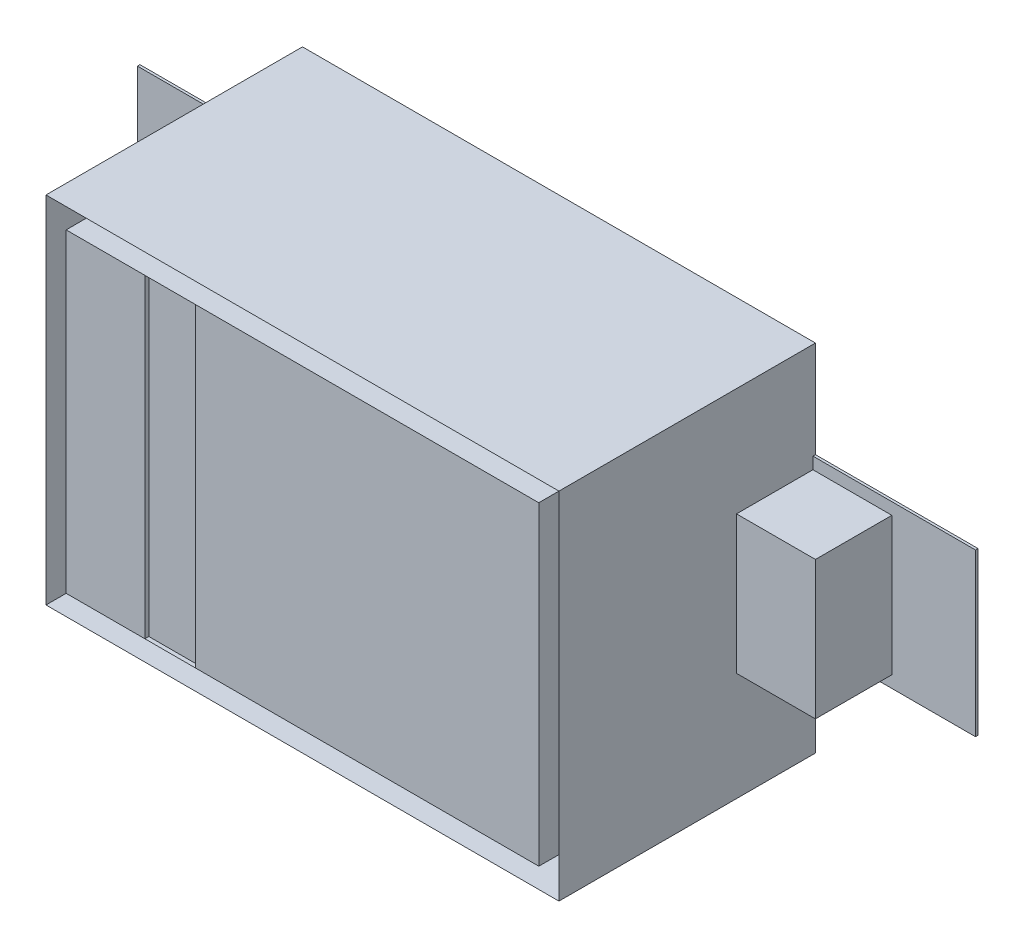
ISO-10303-21;
HEADER;
FILE_DESCRIPTION(('STEP AP214'),'2;1');
FILE_NAME('part.step','',(''),(''),'','','');
FILE_SCHEMA(('AUTOMOTIVE_DESIGN { 1 0 10303 214 1 1 1 1 }'));
ENDSEC;
DATA;
#1=APPLICATION_CONTEXT('core data for automotive mechanical design processes');
#2=APPLICATION_PROTOCOL_DEFINITION('international standard','automotive_design',2000,#1);
#3=PRODUCT_CONTEXT('',#1,'mechanical');
#4=PRODUCT('Part','Part','',(#3));
#5=PRODUCT_RELATED_PRODUCT_CATEGORY('part','',(#4));
#6=PRODUCT_DEFINITION_FORMATION('','',#4);
#7=PRODUCT_DEFINITION_CONTEXT('part definition',#1,'design');
#8=PRODUCT_DEFINITION('design','',#6,#7);
#9=PRODUCT_DEFINITION_SHAPE('','',#8);
#10=(LENGTH_UNIT() NAMED_UNIT(*) SI_UNIT(.MILLI.,.METRE.));
#11=(NAMED_UNIT(*) PLANE_ANGLE_UNIT() SI_UNIT($,.RADIAN.));
#12=(NAMED_UNIT(*) SI_UNIT($,.STERADIAN.) SOLID_ANGLE_UNIT());
#13=UNCERTAINTY_MEASURE_WITH_UNIT(LENGTH_MEASURE(1.E-05),#10,'distance_accuracy_value','');
#14=(GEOMETRIC_REPRESENTATION_CONTEXT(3) GLOBAL_UNCERTAINTY_ASSIGNED_CONTEXT((#13)) GLOBAL_UNIT_ASSIGNED_CONTEXT((#10,
#11,#12)) REPRESENTATION_CONTEXT('',''));
#15=CARTESIAN_POINT('',(0.,0.,0.));
#16=DIRECTION('',(0.,0.,1.));
#17=DIRECTION('',(1.,0.,0.));
#18=AXIS2_PLACEMENT_3D('',#15,#16,#17);
#19=CARTESIAN_POINT('',(1.062,-0.205,0.003));
#20=DIRECTION('',(0.,-1.,0.));
#21=DIRECTION('',(0.,0.,-1.));
#22=AXIS2_PLACEMENT_3D('',#19,#20,#21);
#23=PLANE('',#22);
#24=DIRECTION('',(-1.,0.,0.));
#25=VECTOR('',#24,1.);
#26=CARTESIAN_POINT('',(1.062,-0.205,0.003));
#27=LINE('',#26,#25);
#28=CARTESIAN_POINT('',(1.062,-0.205,0.003));
#29=VERTEX_POINT('',#28);
#30=CARTESIAN_POINT('',(0.6,-0.205,0.003));
#31=VERTEX_POINT('',#30);
#32=EDGE_CURVE('P0_E228',#29,#31,#27,.T.);
#33=ORIENTED_EDGE('',*,*,#32,.F.);
#34=DIRECTION('',(0.,0.,1.));
#35=VECTOR('',#34,1.);
#36=CARTESIAN_POINT('',(1.062,-0.205,0.003));
#37=LINE('',#36,#35);
#38=CARTESIAN_POINT('',(1.062,-0.205,0.00935));
#39=VERTEX_POINT('',#38);
#40=EDGE_CURVE('P0_E11',#29,#39,#37,.T.);
#41=ORIENTED_EDGE('',*,*,#40,.T.);
#42=DIRECTION('',(-1.,0.,0.));
#43=VECTOR('',#42,1.);
#44=CARTESIAN_POINT('',(1.062,-0.205,0.00935));
#45=LINE('',#44,#43);
#46=CARTESIAN_POINT('',(0.599988917148,-0.205,0.00935));
#47=VERTEX_POINT('',#46);
#48=EDGE_CURVE('P0_E190',#39,#47,#45,.T.);
#49=ORIENTED_EDGE('',*,*,#48,.T.);
#50=DIRECTION('',(-0.00174532836589398,0.,0.999998476913288));
#51=VECTOR('',#50,1.);
#52=CARTESIAN_POINT('',(0.6,-0.205,0.003));
#53=LINE('',#52,#51);
#54=EDGE_CURVE('P0_E399',#31,#47,#53,.T.);
#55=ORIENTED_EDGE('',*,*,#54,.F.);
#56=EDGE_LOOP('',(#33,#41,#49,#55));
#57=FACE_BOUND('',#56,.T.);
#58=ADVANCED_FACE('P0_F17',(#57),#23,.T.);
#59=CARTESIAN_POINT('',(1.062,0.205,0.003));
#60=DIRECTION('',(1.,0.,0.));
#61=DIRECTION('',(0.,1.,0.));
#62=AXIS2_PLACEMENT_3D('',#59,#60,#61);
#63=PLANE('',#62);
#64=DIRECTION('',(0.,0.,1.));
#65=VECTOR('',#64,1.);
#66=CARTESIAN_POINT('',(1.062,0.205,0.003));
#67=LINE('',#66,#65);
#68=CARTESIAN_POINT('',(1.062,0.205,0.003));
#69=VERTEX_POINT('',#68);
#70=CARTESIAN_POINT('',(1.062,0.205,0.00935));
#71=VERTEX_POINT('',#70);
#72=EDGE_CURVE('P0_E28',#69,#71,#67,.T.);
#73=ORIENTED_EDGE('',*,*,#72,.T.);
#74=DIRECTION('',(0.,-1.,0.));
#75=VECTOR('',#74,1.);
#76=CARTESIAN_POINT('',(1.062,0.205,0.00935));
#77=LINE('',#76,#75);
#78=EDGE_CURVE('P0_E166',#71,#39,#77,.T.);
#79=ORIENTED_EDGE('',*,*,#78,.T.);
#80=ORIENTED_EDGE('',*,*,#40,.F.);
#81=DIRECTION('',(0.,-1.,0.));
#82=VECTOR('',#81,1.);
#83=CARTESIAN_POINT('',(1.062,0.205,0.003));
#84=LINE('',#83,#82);
#85=EDGE_CURVE('P0_E169',#69,#29,#84,.T.);
#86=ORIENTED_EDGE('',*,*,#85,.F.);
#87=EDGE_LOOP('',(#73,#79,#80,#86));
#88=FACE_BOUND('',#87,.T.);
#89=ADVANCED_FACE('P0_F163',(#88),#63,.T.);
#90=CARTESIAN_POINT('',(0.372,0.205,0.003));
#91=DIRECTION('',(0.,1.,0.));
#92=DIRECTION('',(1.,0.,0.));
#93=AXIS2_PLACEMENT_3D('',#90,#91,#92);
#94=PLANE('',#93);
#95=DIRECTION('',(1.,0.,0.));
#96=VECTOR('',#95,1.);
#97=CARTESIAN_POINT('',(0.599988917148,0.205,0.00935));
#98=LINE('',#97,#96);
#99=CARTESIAN_POINT('',(0.599988917148,0.205,0.00935));
#100=VERTEX_POINT('',#99);
#101=EDGE_CURVE('P0_E177',#100,#71,#98,.T.);
#102=ORIENTED_EDGE('',*,*,#101,.T.);
#103=ORIENTED_EDGE('',*,*,#72,.F.);
#104=DIRECTION('',(1.,0.,0.));
#105=VECTOR('',#104,1.);
#106=CARTESIAN_POINT('',(0.6,0.205,0.003));
#107=LINE('',#106,#105);
#108=CARTESIAN_POINT('',(0.6,0.205,0.003));
#109=VERTEX_POINT('',#108);
#110=EDGE_CURVE('P0_E229',#109,#69,#107,.T.);
#111=ORIENTED_EDGE('',*,*,#110,.F.);
#112=DIRECTION('',(-0.00174532836589398,0.,0.999998476913288));
#113=VECTOR('',#112,1.);
#114=CARTESIAN_POINT('',(0.6,0.205,0.003));
#115=LINE('',#114,#113);
#116=EDGE_CURVE('P0_E179',#109,#100,#115,.T.);
#117=ORIENTED_EDGE('',*,*,#116,.T.);
#118=EDGE_LOOP('',(#102,#103,#111,#117));
#119=FACE_BOUND('',#118,.T.);
#120=ADVANCED_FACE('P0_F178',(#119),#94,.T.);
#121=CARTESIAN_POINT('',(0.85,-0.175,0.003));
#122=DIRECTION('',(0.,-1.,0.));
#123=DIRECTION('',(0.,0.,-1.));
#124=AXIS2_PLACEMENT_3D('',#121,#122,#123);
#125=PLANE('',#124);
#126=DIRECTION('',(0.,0.,1.));
#127=VECTOR('',#126,1.);
#128=CARTESIAN_POINT('',(0.85,-0.175,0.00935));
#129=LINE('',#128,#127);
#130=CARTESIAN_POINT('',(0.85,-0.175,0.00935));
#131=VERTEX_POINT('',#130);
#132=CARTESIAN_POINT('',(0.85,-0.175,0.203));
#133=VERTEX_POINT('',#132);
#134=EDGE_CURVE('P0_E174',#131,#133,#129,.T.);
#135=ORIENTED_EDGE('',*,*,#134,.T.);
#136=DIRECTION('',(-1.,0.,0.));
#137=VECTOR('',#136,1.);
#138=CARTESIAN_POINT('',(0.85,-0.175,0.203));
#139=LINE('',#138,#137);
#140=CARTESIAN_POINT('',(0.5996509337952,-0.175,0.203));
#141=VERTEX_POINT('',#140);
#142=EDGE_CURVE('P0_E261',#133,#141,#139,.T.);
#143=ORIENTED_EDGE('',*,*,#142,.T.);
#144=DIRECTION('',(-0.00174532836589898,0.,0.999998476913288));
#145=VECTOR('',#144,1.);
#146=CARTESIAN_POINT('',(0.599988917148,-0.175,0.00935));
#147=LINE('',#146,#145);
#148=CARTESIAN_POINT('',(0.599988917148,-0.175,0.00935));
#149=VERTEX_POINT('',#148);
#150=EDGE_CURVE('P0_E381',#149,#141,#147,.T.);
#151=ORIENTED_EDGE('',*,*,#150,.F.);
#152=DIRECTION('',(-1.,0.,0.));
#153=VECTOR('',#152,1.);
#154=CARTESIAN_POINT('',(0.85,-0.175,0.00935));
#155=LINE('',#154,#153);
#156=EDGE_CURVE('P0_E199',#131,#149,#155,.T.);
#157=ORIENTED_EDGE('',*,*,#156,.F.);
#158=EDGE_LOOP('',(#135,#143,#151,#157));
#159=FACE_BOUND('',#158,.T.);
#160=ADVANCED_FACE('P0_F770',(#159),#125,.T.);
#161=CARTESIAN_POINT('',(0.85,0.175,0.003));
#162=DIRECTION('',(1.,0.,0.));
#163=DIRECTION('',(0.,1.,0.));
#164=AXIS2_PLACEMENT_3D('',#161,#162,#163);
#165=PLANE('',#164);
#166=DIRECTION('',(0.,0.,1.));
#167=VECTOR('',#166,1.);
#168=CARTESIAN_POINT('',(0.85,0.175,0.00935));
#169=LINE('',#168,#167);
#170=CARTESIAN_POINT('',(0.85,0.175,0.00935));
#171=VERTEX_POINT('',#170);
#172=CARTESIAN_POINT('',(0.85,0.175,0.203));
#173=VERTEX_POINT('',#172);
#174=EDGE_CURVE('P0_E42',#171,#173,#169,.T.);
#175=ORIENTED_EDGE('',*,*,#174,.T.);
#176=DIRECTION('',(0.,-1.,0.));
#177=VECTOR('',#176,1.);
#178=CARTESIAN_POINT('',(0.85,0.175,0.203));
#179=LINE('',#178,#177);
#180=EDGE_CURVE('P0_E264',#173,#133,#179,.T.);
#181=ORIENTED_EDGE('',*,*,#180,.T.);
#182=ORIENTED_EDGE('',*,*,#134,.F.);
#183=DIRECTION('',(0.,-1.,0.));
#184=VECTOR('',#183,1.);
#185=CARTESIAN_POINT('',(0.85,0.175,0.00935));
#186=LINE('',#185,#184);
#187=EDGE_CURVE('P0_E215',#171,#131,#186,.T.);
#188=ORIENTED_EDGE('',*,*,#187,.F.);
#189=EDGE_LOOP('',(#175,#181,#182,#188));
#190=FACE_BOUND('',#189,.T.);
#191=ADVANCED_FACE('P0_F761',(#190),#165,.T.);
#192=CARTESIAN_POINT('',(0.539,0.175,0.003));
#193=DIRECTION('',(0.,1.,0.));
#194=DIRECTION('',(1.,0.,0.));
#195=AXIS2_PLACEMENT_3D('',#192,#193,#194);
#196=PLANE('',#195);
#197=DIRECTION('',(-0.00174532836589898,0.,0.999998476913288));
#198=VECTOR('',#197,1.);
#199=CARTESIAN_POINT('',(0.599988917148,0.175,0.00935));
#200=LINE('',#199,#198);
#201=CARTESIAN_POINT('',(0.599988917148,0.175,0.00935));
#202=VERTEX_POINT('',#201);
#203=CARTESIAN_POINT('',(0.5996509337952,0.175,0.203));
#204=VERTEX_POINT('',#203);
#205=EDGE_CURVE('P0_E396',#202,#204,#200,.T.);
#206=ORIENTED_EDGE('',*,*,#205,.T.);
#207=DIRECTION('',(1.,0.,0.));
#208=VECTOR('',#207,1.);
#209=CARTESIAN_POINT('',(0.5996509337952,0.175,0.203));
#210=LINE('',#209,#208);
#211=EDGE_CURVE('P0_E388',#204,#173,#210,.T.);
#212=ORIENTED_EDGE('',*,*,#211,.T.);
#213=ORIENTED_EDGE('',*,*,#174,.F.);
#214=DIRECTION('',(1.,0.,0.));
#215=VECTOR('',#214,1.);
#216=CARTESIAN_POINT('',(0.599988917148,0.175,0.00935));
#217=LINE('',#216,#215);
#218=EDGE_CURVE('P0_E219',#202,#171,#217,.T.);
#219=ORIENTED_EDGE('',*,*,#218,.F.);
#220=EDGE_LOOP('',(#206,#212,#213,#219));
#221=FACE_BOUND('',#220,.T.);
#222=ADVANCED_FACE('P0_F752',(#221),#196,.T.);
#223=CARTESIAN_POINT('',(0.,0.,0.203));
#224=DIRECTION('',(0.,0.,-1.));
#225=DIRECTION('',(0.,-1.,0.));
#226=AXIS2_PLACEMENT_3D('',#223,#224,#225);
#227=PLANE('',#226);
#228=ORIENTED_EDGE('',*,*,#142,.F.);
#229=ORIENTED_EDGE('',*,*,#180,.F.);
#230=ORIENTED_EDGE('',*,*,#211,.F.);
#231=DIRECTION('',(0.,-1.,0.));
#232=VECTOR('',#231,1.);
#233=CARTESIAN_POINT('',(0.5996509337952,0.175,0.203));
#234=LINE('',#233,#232);
#235=EDGE_CURVE('P0_E385',#204,#141,#234,.T.);
#236=ORIENTED_EDGE('',*,*,#235,.T.);
#237=EDGE_LOOP('',(#228,#229,#230,#236));
#238=FACE_BOUND('',#237,.T.);
#239=ADVANCED_FACE('P0_F683',(#238),#227,.F.);
#240=CARTESIAN_POINT('',(0.,0.,0.203));
#241=DIRECTION('',(0.,0.,-1.));
#242=DIRECTION('',(0.,-1.,0.));
#243=AXIS2_PLACEMENT_3D('',#240,#241,#242);
#244=PLANE('',#243);
#245=DIRECTION('',(1.,0.,0.));
#246=VECTOR('',#245,1.);
#247=CARTESIAN_POINT('',(-0.85,0.175,0.203));
#248=LINE('',#247,#246);
#249=CARTESIAN_POINT('',(-0.85,0.175,0.203));
#250=VERTEX_POINT('',#249);
#251=CARTESIAN_POINT('',(-0.5996509337952,0.175,0.203));
#252=VERTEX_POINT('',#251);
#253=EDGE_CURVE('P0_E203',#250,#252,#248,.T.);
#254=ORIENTED_EDGE('',*,*,#253,.F.);
#255=DIRECTION('',(0.,1.,0.));
#256=VECTOR('',#255,1.);
#257=CARTESIAN_POINT('',(-0.85,-0.175,0.203));
#258=LINE('',#257,#256);
#259=CARTESIAN_POINT('',(-0.85,-0.175,0.203));
#260=VERTEX_POINT('',#259);
#261=EDGE_CURVE('P0_E266',#260,#250,#258,.T.);
#262=ORIENTED_EDGE('',*,*,#261,.F.);
#263=DIRECTION('',(-1.,0.,0.));
#264=VECTOR('',#263,1.);
#265=CARTESIAN_POINT('',(-0.5996509337952,-0.175,0.203));
#266=LINE('',#265,#264);
#267=CARTESIAN_POINT('',(-0.5996509337952,-0.175,0.203));
#268=VERTEX_POINT('',#267);
#269=EDGE_CURVE('P0_E313',#268,#260,#266,.T.);
#270=ORIENTED_EDGE('',*,*,#269,.F.);
#271=DIRECTION('',(0.,-1.,0.));
#272=VECTOR('',#271,1.);
#273=CARTESIAN_POINT('',(-0.5996509337952,0.175,0.203));
#274=LINE('',#273,#272);
#275=EDGE_CURVE('P0_E319',#252,#268,#274,.T.);
#276=ORIENTED_EDGE('',*,*,#275,.F.);
#277=EDGE_LOOP('',(#254,#262,#270,#276));
#278=FACE_BOUND('',#277,.T.);
#279=ADVANCED_FACE('P0_F677',(#278),#244,.F.);
#280=CARTESIAN_POINT('',(-0.85,0.175,0.003));
#281=DIRECTION('',(0.,1.,0.));
#282=DIRECTION('',(1.,0.,0.));
#283=AXIS2_PLACEMENT_3D('',#280,#281,#282);
#284=PLANE('',#283);
#285=DIRECTION('',(1.,0.,0.));
#286=VECTOR('',#285,1.);
#287=CARTESIAN_POINT('',(-0.85,0.175,0.00935));
#288=LINE('',#287,#286);
#289=CARTESIAN_POINT('',(-0.85,0.175,0.00935));
#290=VERTEX_POINT('',#289);
#291=CARTESIAN_POINT('',(-0.599988917148,0.175,0.00935));
#292=VERTEX_POINT('',#291);
#293=EDGE_CURVE('P0_E278',#290,#292,#288,.T.);
#294=ORIENTED_EDGE('',*,*,#293,.F.);
#295=DIRECTION('',(0.,0.,1.));
#296=VECTOR('',#295,1.);
#297=CARTESIAN_POINT('',(-0.85,0.175,0.00935));
#298=LINE('',#297,#296);
#299=EDGE_CURVE('P0_E270',#290,#250,#298,.T.);
#300=ORIENTED_EDGE('',*,*,#299,.T.);
#301=ORIENTED_EDGE('',*,*,#253,.T.);
#302=DIRECTION('',(0.00174532836589898,0.,0.999998476913288));
#303=VECTOR('',#302,1.);
#304=CARTESIAN_POINT('',(-0.599988917148,0.175,0.00935));
#305=LINE('',#304,#303);
#306=EDGE_CURVE('P0_E184',#292,#252,#305,.T.);
#307=ORIENTED_EDGE('',*,*,#306,.F.);
#308=EDGE_LOOP('',(#294,#300,#301,#307));
#309=FACE_BOUND('',#308,.T.);
#310=ADVANCED_FACE('P0_F682',(#309),#284,.T.);
#311=CARTESIAN_POINT('',(-0.85,-0.175,0.003));
#312=DIRECTION('',(-1.,0.,0.));
#313=DIRECTION('',(0.,0.,1.));
#314=AXIS2_PLACEMENT_3D('',#311,#312,#313);
#315=PLANE('',#314);
#316=DIRECTION('',(0.,0.,1.));
#317=VECTOR('',#316,1.);
#318=CARTESIAN_POINT('',(-0.85,-0.175,0.00935));
#319=LINE('',#318,#317);
#320=CARTESIAN_POINT('',(-0.85,-0.175,0.00935));
#321=VERTEX_POINT('',#320);
#322=EDGE_CURVE('P0_E140',#321,#260,#319,.T.);
#323=ORIENTED_EDGE('',*,*,#322,.T.);
#324=ORIENTED_EDGE('',*,*,#261,.T.);
#325=ORIENTED_EDGE('',*,*,#299,.F.);
#326=DIRECTION('',(0.,1.,0.));
#327=VECTOR('',#326,1.);
#328=CARTESIAN_POINT('',(-0.85,-0.175,0.00935));
#329=LINE('',#328,#327);
#330=EDGE_CURVE('P0_E274',#321,#290,#329,.T.);
#331=ORIENTED_EDGE('',*,*,#330,.F.);
#332=EDGE_LOOP('',(#323,#324,#325,#331));
#333=FACE_BOUND('',#332,.T.);
#334=ADVANCED_FACE('P0_F693',(#333),#315,.T.);
#335=CARTESIAN_POINT('',(-0.539,-0.175,0.003));
#336=DIRECTION('',(0.,-1.,0.));
#337=DIRECTION('',(0.,0.,-1.));
#338=AXIS2_PLACEMENT_3D('',#335,#336,#337);
#339=PLANE('',#338);
#340=ORIENTED_EDGE('',*,*,#269,.T.);
#341=ORIENTED_EDGE('',*,*,#322,.F.);
#342=DIRECTION('',(-1.,0.,0.));
#343=VECTOR('',#342,1.);
#344=CARTESIAN_POINT('',(-0.599988917148,-0.175,0.00935));
#345=LINE('',#344,#343);
#346=CARTESIAN_POINT('',(-0.599988917148,-0.175,0.00935));
#347=VERTEX_POINT('',#346);
#348=EDGE_CURVE('P0_E279',#347,#321,#345,.T.);
#349=ORIENTED_EDGE('',*,*,#348,.F.);
#350=DIRECTION('',(0.00174532836589898,0.,0.999998476913288));
#351=VECTOR('',#350,1.);
#352=CARTESIAN_POINT('',(-0.599988917148,-0.175,0.00935));
#353=LINE('',#352,#351);
#354=EDGE_CURVE('P0_E128',#347,#268,#353,.T.);
#355=ORIENTED_EDGE('',*,*,#354,.T.);
#356=EDGE_LOOP('',(#340,#341,#349,#355));
#357=FACE_BOUND('',#356,.T.);
#358=ADVANCED_FACE('P0_F635',(#357),#339,.T.);
#359=CARTESIAN_POINT('',(-1.635867508193,-0.4,0.003));
#360=DIRECTION('',(0.,-0.999998476913288,0.00174532836589798));
#361=DIRECTION('',(-1.,0.,0.));
#362=AXIS2_PLACEMENT_3D('',#359,#360,#361);
#363=PLANE('',#362);
#364=DIRECTION('',(1.,0.,0.));
#365=VECTOR('',#364,1.);
#366=CARTESIAN_POINT('',(-0.5988655348343,-0.3988655348343,0.653));
#367=LINE('',#366,#365);
#368=CARTESIAN_POINT('',(-0.5988655348343,-0.3988655348343,0.653));
#369=VERTEX_POINT('',#368);
#370=CARTESIAN_POINT('',(-0.3993892783859,-0.3988655348343,0.653));
#371=VERTEX_POINT('',#370);
#372=EDGE_CURVE('P0_E284',#369,#371,#367,.T.);
#373=ORIENTED_EDGE('',*,*,#372,.F.);
#374=DIRECTION('',(0.00174532570762006,0.00174532570762006,0.999996953833535));
#375=VECTOR('',#374,1.);
#376=CARTESIAN_POINT('',(-0.6,-0.4,0.003));
#377=LINE('',#376,#375);
#378=CARTESIAN_POINT('',(-0.6,-0.4,0.003));
#379=VERTEX_POINT('',#378);
#380=EDGE_CURVE('P0_E301',#379,#369,#377,.T.);
#381=ORIENTED_EDGE('',*,*,#380,.F.);
#382=DIRECTION('',(-1.,0.,0.));
#383=VECTOR('',#382,1.);
#384=CARTESIAN_POINT('',(0.6,-0.4,0.003));
#385=LINE('',#384,#383);
#386=CARTESIAN_POINT('',(0.6,-0.4,0.003));
#387=VERTEX_POINT('',#386);
#388=EDGE_CURVE('P0_E210',#387,#379,#385,.T.);
#389=ORIENTED_EDGE('',*,*,#388,.F.);
#390=DIRECTION('',(-0.00174532570762006,0.00174532570762006,0.999996953833535));
#391=VECTOR('',#390,1.);
#392=CARTESIAN_POINT('',(0.6,-0.4,0.003));
#393=LINE('',#392,#391);
#394=CARTESIAN_POINT('',(0.5988655348343,-0.3988655348343,0.653));
#395=VERTEX_POINT('',#394);
#396=EDGE_CURVE('P0_E367',#387,#395,#393,.T.);
#397=ORIENTED_EDGE('',*,*,#396,.T.);
#398=DIRECTION('',(1.,0.,0.));
#399=VECTOR('',#398,1.);
#400=CARTESIAN_POINT('',(-0.270648412093,-0.3988655348343,0.653));
#401=LINE('',#400,#399);
#402=CARTESIAN_POINT('',(-0.270648412093,-0.3988655348343,0.653));
#403=VERTEX_POINT('',#402);
#404=EDGE_CURVE('P0_E250',#403,#395,#401,.T.);
#405=ORIENTED_EDGE('',*,*,#404,.F.);
#406=DIRECTION('',(1.,0.,0.));
#407=VECTOR('',#406,1.);
#408=CARTESIAN_POINT('',(-0.3993892783859,-0.3988655348343,0.653));
#409=LINE('',#408,#407);
#410=EDGE_CURVE('P0_E309',#371,#403,#409,.T.);
#411=ORIENTED_EDGE('',*,*,#410,.F.);
#412=EDGE_LOOP('',(#373,#381,#389,#397,#405,#411));
#413=FACE_BOUND('',#412,.T.);
#414=ADVANCED_FACE('P0_F575',(#413),#363,.T.);
#415=CARTESIAN_POINT('',(-0.3993892783859,-0.3988655348343,0.653));
#416=DIRECTION('',(0.,-1.,0.));
#417=DIRECTION('',(0.,0.,-1.));
#418=AXIS2_PLACEMENT_3D('',#415,#416,#417);
#419=PLANE('',#418);
#420=DIRECTION('',(0.,0.,-1.));
#421=VECTOR('',#420,1.);
#422=CARTESIAN_POINT('',(-0.270648412093,-0.3988655348343,0.653));
#423=LINE('',#422,#421);
#424=CARTESIAN_POINT('',(-0.270648412093,-0.3988655348343,0.643));
#425=VERTEX_POINT('',#424);
#426=EDGE_CURVE('P0_E233',#403,#425,#423,.T.);
#427=ORIENTED_EDGE('',*,*,#426,.T.);
#428=DIRECTION('',(1.,0.,0.));
#429=VECTOR('',#428,1.);
#430=CARTESIAN_POINT('',(-0.3993892783859,-0.3988655348343,0.643));
#431=LINE('',#430,#429);
#432=CARTESIAN_POINT('',(-0.3993892783859,-0.3988655348343,0.643));
#433=VERTEX_POINT('',#432);
#434=EDGE_CURVE('P0_E254',#433,#425,#431,.T.);
#435=ORIENTED_EDGE('',*,*,#434,.F.);
#436=DIRECTION('',(0.,0.,-1.));
#437=VECTOR('',#436,1.);
#438=CARTESIAN_POINT('',(-0.3993892783859,-0.3988655348343,0.653));
#439=LINE('',#438,#437);
#440=EDGE_CURVE('P0_E245',#371,#433,#439,.T.);
#441=ORIENTED_EDGE('',*,*,#440,.F.);
#442=ORIENTED_EDGE('',*,*,#410,.T.);
#443=EDGE_LOOP('',(#427,#435,#441,#442));
#444=FACE_BOUND('',#443,.T.);
#445=ADVANCED_FACE('P0_F634',(#444),#419,.F.);
#446=CARTESIAN_POINT('',(0.,0.,0.643));
#447=DIRECTION('',(0.,0.,1.));
#448=DIRECTION('',(1.,0.,0.));
#449=AXIS2_PLACEMENT_3D('',#446,#447,#448);
#450=PLANE('',#449);
#451=ORIENTED_EDGE('',*,*,#434,.T.);
#452=DIRECTION('',(0.,1.,0.));
#453=VECTOR('',#452,1.);
#454=CARTESIAN_POINT('',(-0.270648412093,-0.3988655348343,0.643));
#455=LINE('',#454,#453);
#456=CARTESIAN_POINT('',(-0.270648412093,0.3988655348343,0.643));
#457=VERTEX_POINT('',#456);
#458=EDGE_CURVE('P0_E230',#425,#457,#455,.T.);
#459=ORIENTED_EDGE('',*,*,#458,.T.);
#460=DIRECTION('',(-1.,0.,0.));
#461=VECTOR('',#460,1.);
#462=CARTESIAN_POINT('',(-0.270648412093,0.3988655348343,0.643));
#463=LINE('',#462,#461);
#464=CARTESIAN_POINT('',(-0.3993892783859,0.3988655348343,0.643));
#465=VERTEX_POINT('',#464);
#466=EDGE_CURVE('P0_E259',#457,#465,#463,.T.);
#467=ORIENTED_EDGE('',*,*,#466,.T.);
#468=DIRECTION('',(0.,-1.,0.));
#469=VECTOR('',#468,1.);
#470=CARTESIAN_POINT('',(-0.3993892783859,0.3988655348343,0.643));
#471=LINE('',#470,#469);
#472=EDGE_CURVE('P0_E249',#465,#433,#471,.T.);
#473=ORIENTED_EDGE('',*,*,#472,.T.);
#474=EDGE_LOOP('',(#451,#459,#467,#473));
#475=FACE_BOUND('',#474,.T.);
#476=ADVANCED_FACE('P0_F669',(#475),#450,.T.);
#477=CARTESIAN_POINT('',(-0.3993892783859,0.3988655348343,0.653));
#478=DIRECTION('',(-1.,0.,0.));
#479=DIRECTION('',(0.,0.,1.));
#480=AXIS2_PLACEMENT_3D('',#477,#478,#479);
#481=PLANE('',#480);
#482=ORIENTED_EDGE('',*,*,#440,.T.);
#483=ORIENTED_EDGE('',*,*,#472,.F.);
#484=DIRECTION('',(0.,0.,-1.));
#485=VECTOR('',#484,1.);
#486=CARTESIAN_POINT('',(-0.3993892783859,0.3988655348343,0.653));
#487=LINE('',#486,#485);
#488=CARTESIAN_POINT('',(-0.3993892783859,0.3988655348343,0.653));
#489=VERTEX_POINT('',#488);
#490=EDGE_CURVE('P0_E255',#489,#465,#487,.T.);
#491=ORIENTED_EDGE('',*,*,#490,.F.);
#492=DIRECTION('',(0.,1.,0.));
#493=VECTOR('',#492,1.);
#494=CARTESIAN_POINT('',(-0.3993892783859,-0.3988655348343,0.653));
#495=LINE('',#494,#493);
#496=EDGE_CURVE('P0_E288',#371,#489,#495,.T.);
#497=ORIENTED_EDGE('',*,*,#496,.F.);
#498=EDGE_LOOP('',(#482,#483,#491,#497));
#499=FACE_BOUND('',#498,.T.);
#500=ADVANCED_FACE('P0_F645',(#499),#481,.F.);
#501=CARTESIAN_POINT('',(0.,0.,0.653));
#502=DIRECTION('',(0.,0.,1.));
#503=DIRECTION('',(1.,0.,0.));
#504=AXIS2_PLACEMENT_3D('',#501,#502,#503);
#505=PLANE('',#504);
#506=ORIENTED_EDGE('',*,*,#404,.T.);
#507=DIRECTION('',(0.,1.,0.));
#508=VECTOR('',#507,1.);
#509=CARTESIAN_POINT('',(0.5988655348343,-0.3988655348343,0.653));
#510=LINE('',#509,#508);
#511=CARTESIAN_POINT('',(0.5988655348343,0.3988655348343,0.653));
#512=VERTEX_POINT('',#511);
#513=EDGE_CURVE('P0_E345',#395,#512,#510,.T.);
#514=ORIENTED_EDGE('',*,*,#513,.T.);
#515=DIRECTION('',(-1.,0.,0.));
#516=VECTOR('',#515,1.);
#517=CARTESIAN_POINT('',(0.5988655348343,0.3988655348343,0.653));
#518=LINE('',#517,#516);
#519=CARTESIAN_POINT('',(-0.270648412093,0.3988655348343,0.653));
#520=VERTEX_POINT('',#519);
#521=EDGE_CURVE('P0_E208',#512,#520,#518,.T.);
#522=ORIENTED_EDGE('',*,*,#521,.T.);
#523=DIRECTION('',(0.,1.,0.));
#524=VECTOR('',#523,1.);
#525=CARTESIAN_POINT('',(-0.270648412093,-0.3988655348343,0.653));
#526=LINE('',#525,#524);
#527=EDGE_CURVE('P0_E283',#403,#520,#526,.T.);
#528=ORIENTED_EDGE('',*,*,#527,.F.);
#529=EDGE_LOOP('',(#506,#514,#522,#528));
#530=FACE_BOUND('',#529,.T.);
#531=ADVANCED_FACE('P0_F581',(#530),#505,.T.);
#532=CARTESIAN_POINT('',(0.,0.,0.653));
#533=DIRECTION('',(0.,0.,1.));
#534=DIRECTION('',(1.,0.,0.));
#535=AXIS2_PLACEMENT_3D('',#532,#533,#534);
#536=PLANE('',#535);
#537=DIRECTION('',(-1.,0.,0.));
#538=VECTOR('',#537,1.);
#539=CARTESIAN_POINT('',(-0.3993892783859,0.3988655348343,0.653));
#540=LINE('',#539,#538);
#541=CARTESIAN_POINT('',(-0.5988655348343,0.3988655348343,0.653));
#542=VERTEX_POINT('',#541);
#543=EDGE_CURVE('P0_E332',#489,#542,#540,.T.);
#544=ORIENTED_EDGE('',*,*,#543,.T.);
#545=DIRECTION('',(0.,-1.,0.));
#546=VECTOR('',#545,1.);
#547=CARTESIAN_POINT('',(-0.5988655348343,0.3988655348343,0.653));
#548=LINE('',#547,#546);
#549=EDGE_CURVE('P0_E368',#542,#369,#548,.T.);
#550=ORIENTED_EDGE('',*,*,#549,.T.);
#551=ORIENTED_EDGE('',*,*,#372,.T.);
#552=ORIENTED_EDGE('',*,*,#496,.T.);
#553=EDGE_LOOP('',(#544,#550,#551,#552));
#554=FACE_BOUND('',#553,.T.);
#555=ADVANCED_FACE('P0_F577',(#554),#536,.T.);
#556=CARTESIAN_POINT('',(-0.270648412093,-0.3988655348343,0.653));
#557=DIRECTION('',(1.,0.,0.));
#558=DIRECTION('',(0.,1.,0.));
#559=AXIS2_PLACEMENT_3D('',#556,#557,#558);
#560=PLANE('',#559);
#561=DIRECTION('',(0.,0.,-1.));
#562=VECTOR('',#561,1.);
#563=CARTESIAN_POINT('',(-0.270648412093,0.3988655348343,0.653));
#564=LINE('',#563,#562);
#565=EDGE_CURVE('P0_E234',#520,#457,#564,.T.);
#566=ORIENTED_EDGE('',*,*,#565,.T.);
#567=ORIENTED_EDGE('',*,*,#458,.F.);
#568=ORIENTED_EDGE('',*,*,#426,.F.);
#569=ORIENTED_EDGE('',*,*,#527,.T.);
#570=EDGE_LOOP('',(#566,#567,#568,#569));
#571=FACE_BOUND('',#570,.T.);
#572=ADVANCED_FACE('P0_F19',(#571),#560,.F.);
#573=CARTESIAN_POINT('',(-0.270648412093,0.3988655348343,0.653));
#574=DIRECTION('',(0.,1.,0.));
#575=DIRECTION('',(1.,0.,0.));
#576=AXIS2_PLACEMENT_3D('',#573,#574,#575);
#577=PLANE('',#576);
#578=ORIENTED_EDGE('',*,*,#490,.T.);
#579=ORIENTED_EDGE('',*,*,#466,.F.);
#580=ORIENTED_EDGE('',*,*,#565,.F.);
#581=DIRECTION('',(-1.,0.,0.));
#582=VECTOR('',#581,1.);
#583=CARTESIAN_POINT('',(-0.270648412093,0.3988655348343,0.653));
#584=LINE('',#583,#582);
#585=EDGE_CURVE('P0_E260',#520,#489,#584,.T.);
#586=ORIENTED_EDGE('',*,*,#585,.T.);
#587=EDGE_LOOP('',(#578,#579,#580,#586));
#588=FACE_BOUND('',#587,.T.);
#589=ADVANCED_FACE('P0_F603',(#588),#577,.F.);
#590=CARTESIAN_POINT('',(1.635867508193,0.4,0.003));
#591=DIRECTION('',(0.,0.999998476913288,0.00174532836589798));
#592=DIRECTION('',(1.,0.,0.));
#593=AXIS2_PLACEMENT_3D('',#590,#591,#592);
#594=PLANE('',#593);
#595=ORIENTED_EDGE('',*,*,#521,.F.);
#596=DIRECTION('',(-0.00174532570762006,-0.00174532570762006,0.999996953833535));
#597=VECTOR('',#596,1.);
#598=CARTESIAN_POINT('',(0.6,0.4,0.003));
#599=LINE('',#598,#597);
#600=CARTESIAN_POINT('',(0.6,0.4,0.003));
#601=VERTEX_POINT('',#600);
#602=EDGE_CURVE('P0_E338',#601,#512,#599,.T.);
#603=ORIENTED_EDGE('',*,*,#602,.F.);
#604=DIRECTION('',(1.,0.,0.));
#605=VECTOR('',#604,1.);
#606=CARTESIAN_POINT('',(-0.6,0.4,0.003));
#607=LINE('',#606,#605);
#608=CARTESIAN_POINT('',(-0.6,0.4,0.003));
#609=VERTEX_POINT('',#608);
#610=EDGE_CURVE('P0_E320',#609,#601,#607,.T.);
#611=ORIENTED_EDGE('',*,*,#610,.F.);
#612=DIRECTION('',(0.00174532570762006,-0.00174532570762006,0.999996953833535));
#613=VECTOR('',#612,1.);
#614=CARTESIAN_POINT('',(-0.6,0.4,0.003));
#615=LINE('',#614,#613);
#616=EDGE_CURVE('P0_E363',#609,#542,#615,.T.);
#617=ORIENTED_EDGE('',*,*,#616,.T.);
#618=ORIENTED_EDGE('',*,*,#543,.F.);
#619=ORIENTED_EDGE('',*,*,#585,.F.);
#620=EDGE_LOOP('',(#595,#603,#611,#617,#618,#619));
#621=FACE_BOUND('',#620,.T.);
#622=ADVANCED_FACE('P0_F566',(#621),#594,.T.);
#623=CARTESIAN_POINT('',(-0.372,-0.205,0.003));
#624=DIRECTION('',(0.,-1.,0.));
#625=DIRECTION('',(0.,0.,-1.));
#626=AXIS2_PLACEMENT_3D('',#623,#624,#625);
#627=PLANE('',#626);
#628=DIRECTION('',(-1.,0.,0.));
#629=VECTOR('',#628,1.);
#630=CARTESIAN_POINT('',(-0.599988917148,-0.205,0.00935));
#631=LINE('',#630,#629);
#632=CARTESIAN_POINT('',(-0.599988917148,-0.205,0.00935));
#633=VERTEX_POINT('',#632);
#634=CARTESIAN_POINT('',(-1.062,-0.205,0.00935));
#635=VERTEX_POINT('',#634);
#636=EDGE_CURVE('P0_E220',#633,#635,#631,.T.);
#637=ORIENTED_EDGE('',*,*,#636,.T.);
#638=DIRECTION('',(0.,0.,1.));
#639=VECTOR('',#638,1.);
#640=CARTESIAN_POINT('',(-1.062,-0.205,0.003));
#641=LINE('',#640,#639);
#642=CARTESIAN_POINT('',(-1.062,-0.205,0.003));
#643=VERTEX_POINT('',#642);
#644=EDGE_CURVE('P0_E205',#643,#635,#641,.T.);
#645=ORIENTED_EDGE('',*,*,#644,.F.);
#646=DIRECTION('',(-1.,0.,0.));
#647=VECTOR('',#646,1.);
#648=CARTESIAN_POINT('',(-0.6,-0.205,0.003));
#649=LINE('',#648,#647);
#650=CARTESIAN_POINT('',(-0.6,-0.205,0.003));
#651=VERTEX_POINT('',#650);
#652=EDGE_CURVE('P0_E238',#651,#643,#649,.T.);
#653=ORIENTED_EDGE('',*,*,#652,.F.);
#654=DIRECTION('',(0.00174532836589398,0.,0.999998476913288));
#655=VECTOR('',#654,1.);
#656=CARTESIAN_POINT('',(-0.6,-0.205,0.003));
#657=LINE('',#656,#655);
#658=EDGE_CURVE('P0_E298',#651,#633,#657,.T.);
#659=ORIENTED_EDGE('',*,*,#658,.T.);
#660=EDGE_LOOP('',(#637,#645,#653,#659));
#661=FACE_BOUND('',#660,.T.);
#662=ADVANCED_FACE('P0_F572',(#661),#627,.T.);
#663=CARTESIAN_POINT('',(-1.062,-0.205,0.003));
#664=DIRECTION('',(-1.,0.,0.));
#665=DIRECTION('',(0.,0.,1.));
#666=AXIS2_PLACEMENT_3D('',#663,#664,#665);
#667=PLANE('',#666);
#668=ORIENTED_EDGE('',*,*,#644,.T.);
#669=DIRECTION('',(0.,1.,0.));
#670=VECTOR('',#669,1.);
#671=CARTESIAN_POINT('',(-1.062,-0.205,0.00935));
#672=LINE('',#671,#670);
#673=CARTESIAN_POINT('',(-1.062,0.205,0.00935));
#674=VERTEX_POINT('',#673);
#675=EDGE_CURVE('P0_E224',#635,#674,#672,.T.);
#676=ORIENTED_EDGE('',*,*,#675,.T.);
#677=DIRECTION('',(0.,0.,1.));
#678=VECTOR('',#677,1.);
#679=CARTESIAN_POINT('',(-1.062,0.205,0.003));
#680=LINE('',#679,#678);
#681=CARTESIAN_POINT('',(-1.062,0.205,0.003));
#682=VERTEX_POINT('',#681);
#683=EDGE_CURVE('P0_E209',#682,#674,#680,.T.);
#684=ORIENTED_EDGE('',*,*,#683,.F.);
#685=DIRECTION('',(0.,1.,0.));
#686=VECTOR('',#685,1.);
#687=CARTESIAN_POINT('',(-1.062,-0.205,0.003));
#688=LINE('',#687,#686);
#689=EDGE_CURVE('P0_E244',#643,#682,#688,.T.);
#690=ORIENTED_EDGE('',*,*,#689,.F.);
#691=EDGE_LOOP('',(#668,#676,#684,#690));
#692=FACE_BOUND('',#691,.T.);
#693=ADVANCED_FACE('P0_F471',(#692),#667,.T.);
#694=CARTESIAN_POINT('',(-1.062,0.205,0.003));
#695=DIRECTION('',(0.,1.,0.));
#696=DIRECTION('',(1.,0.,0.));
#697=AXIS2_PLACEMENT_3D('',#694,#695,#696);
#698=PLANE('',#697);
#699=DIRECTION('',(1.,0.,0.));
#700=VECTOR('',#699,1.);
#701=CARTESIAN_POINT('',(-1.062,0.205,0.003));
#702=LINE('',#701,#700);
#703=CARTESIAN_POINT('',(-0.6,0.205,0.003));
#704=VERTEX_POINT('',#703);
#705=EDGE_CURVE('P0_E239',#682,#704,#702,.T.);
#706=ORIENTED_EDGE('',*,*,#705,.F.);
#707=ORIENTED_EDGE('',*,*,#683,.T.);
#708=DIRECTION('',(1.,0.,0.));
#709=VECTOR('',#708,1.);
#710=CARTESIAN_POINT('',(-1.062,0.205,0.00935));
#711=LINE('',#710,#709);
#712=CARTESIAN_POINT('',(-0.599988917148,0.205,0.00935));
#713=VERTEX_POINT('',#712);
#714=EDGE_CURVE('P0_E395',#674,#713,#711,.T.);
#715=ORIENTED_EDGE('',*,*,#714,.T.);
#716=DIRECTION('',(0.00174532836589398,0.,0.999998476913288));
#717=VECTOR('',#716,1.);
#718=CARTESIAN_POINT('',(-0.6,0.205,0.003));
#719=LINE('',#718,#717);
#720=EDGE_CURVE('P0_E305',#704,#713,#719,.T.);
#721=ORIENTED_EDGE('',*,*,#720,.F.);
#722=EDGE_LOOP('',(#706,#707,#715,#721));
#723=FACE_BOUND('',#722,.T.);
#724=ADVANCED_FACE('P0_F482',(#723),#698,.T.);
#725=CARTESIAN_POINT('',(-0.6,1.435867508193,0.003));
#726=DIRECTION('',(-0.999998476913288,0.,0.00174532836589798));
#727=DIRECTION('',(0.,1.,0.));
#728=AXIS2_PLACEMENT_3D('',#725,#726,#727);
#729=PLANE('',#728);
#730=ORIENTED_EDGE('',*,*,#306,.T.);
#731=ORIENTED_EDGE('',*,*,#275,.T.);
#732=ORIENTED_EDGE('',*,*,#354,.F.);
#733=DIRECTION('',(0.,-1.,0.));
#734=VECTOR('',#733,1.);
#735=CARTESIAN_POINT('',(-0.599988917148,-0.175,0.00935));
#736=LINE('',#735,#734);
#737=EDGE_CURVE('P0_E223',#347,#633,#736,.T.);
#738=ORIENTED_EDGE('',*,*,#737,.T.);
#739=ORIENTED_EDGE('',*,*,#658,.F.);
#740=DIRECTION('',(0.,1.,0.));
#741=VECTOR('',#740,1.);
#742=CARTESIAN_POINT('',(-0.6,-0.4,0.003));
#743=LINE('',#742,#741);
#744=EDGE_CURVE('P0_E214',#379,#651,#743,.T.);
#745=ORIENTED_EDGE('',*,*,#744,.F.);
#746=ORIENTED_EDGE('',*,*,#380,.T.);
#747=ORIENTED_EDGE('',*,*,#549,.F.);
#748=ORIENTED_EDGE('',*,*,#616,.F.);
#749=DIRECTION('',(0.,1.,0.));
#750=VECTOR('',#749,1.);
#751=CARTESIAN_POINT('',(-0.6,0.205,0.003));
#752=LINE('',#751,#750);
#753=EDGE_CURVE('P0_E243',#704,#609,#752,.T.);
#754=ORIENTED_EDGE('',*,*,#753,.F.);
#755=ORIENTED_EDGE('',*,*,#720,.T.);
#756=DIRECTION('',(0.,-1.,0.));
#757=VECTOR('',#756,1.);
#758=CARTESIAN_POINT('',(-0.599988917148,0.205,0.00935));
#759=LINE('',#758,#757);
#760=EDGE_CURVE('P0_E292',#713,#292,#759,.T.);
#761=ORIENTED_EDGE('',*,*,#760,.T.);
#762=EDGE_LOOP('',(#730,#731,#732,#738,#739,#745,#746,#747,#748,#754,#755,#761));
#763=FACE_BOUND('',#762,.T.);
#764=ADVANCED_FACE('P0_F562',(#763),#729,.T.);
#765=CARTESIAN_POINT('',(0.,0.,0.00935));
#766=DIRECTION('',(0.,0.,-1.));
#767=DIRECTION('',(0.,-1.,0.));
#768=AXIS2_PLACEMENT_3D('',#765,#766,#767);
#769=PLANE('',#768);
#770=ORIENTED_EDGE('',*,*,#218,.T.);
#771=ORIENTED_EDGE('',*,*,#187,.T.);
#772=ORIENTED_EDGE('',*,*,#156,.T.);
#773=DIRECTION('',(0.,-1.,0.));
#774=VECTOR('',#773,1.);
#775=CARTESIAN_POINT('',(0.599988917148,-0.175,0.00935));
#776=LINE('',#775,#774);
#777=EDGE_CURVE('P0_E21',#149,#47,#776,.T.);
#778=ORIENTED_EDGE('',*,*,#777,.T.);
#779=ORIENTED_EDGE('',*,*,#48,.F.);
#780=ORIENTED_EDGE('',*,*,#78,.F.);
#781=ORIENTED_EDGE('',*,*,#101,.F.);
#782=DIRECTION('',(0.,-1.,0.));
#783=VECTOR('',#782,1.);
#784=CARTESIAN_POINT('',(0.599988917148,0.205,0.00935));
#785=LINE('',#784,#783);
#786=EDGE_CURVE('P0_E392',#100,#202,#785,.T.);
#787=ORIENTED_EDGE('',*,*,#786,.T.);
#788=EDGE_LOOP('',(#770,#771,#772,#778,#779,#780,#781,#787));
#789=FACE_BOUND('',#788,.T.);
#790=ADVANCED_FACE('P0_F187',(#789),#769,.F.);
#791=CARTESIAN_POINT('',(0.,0.,0.00935));
#792=DIRECTION('',(0.,0.,-1.));
#793=DIRECTION('',(0.,-1.,0.));
#794=AXIS2_PLACEMENT_3D('',#791,#792,#793);
#795=PLANE('',#794);
#796=ORIENTED_EDGE('',*,*,#714,.F.);
#797=ORIENTED_EDGE('',*,*,#675,.F.);
#798=ORIENTED_EDGE('',*,*,#636,.F.);
#799=ORIENTED_EDGE('',*,*,#737,.F.);
#800=ORIENTED_EDGE('',*,*,#348,.T.);
#801=ORIENTED_EDGE('',*,*,#330,.T.);
#802=ORIENTED_EDGE('',*,*,#293,.T.);
#803=ORIENTED_EDGE('',*,*,#760,.F.);
#804=EDGE_LOOP('',(#796,#797,#798,#799,#800,#801,#802,#803));
#805=FACE_BOUND('',#804,.T.);
#806=ADVANCED_FACE('P0_F480',(#805),#795,.F.);
#807=CARTESIAN_POINT('',(0.6,-1.435867508193,0.003));
#808=DIRECTION('',(0.999998476913288,0.,0.00174532836589798));
#809=DIRECTION('',(0.,-1.,0.));
#810=AXIS2_PLACEMENT_3D('',#807,#808,#809);
#811=PLANE('',#810);
#812=ORIENTED_EDGE('',*,*,#116,.F.);
#813=DIRECTION('',(0.,-1.,0.));
#814=VECTOR('',#813,1.);
#815=CARTESIAN_POINT('',(0.6,0.4,0.003));
#816=LINE('',#815,#814);
#817=EDGE_CURVE('P0_E273',#601,#109,#816,.T.);
#818=ORIENTED_EDGE('',*,*,#817,.F.);
#819=ORIENTED_EDGE('',*,*,#602,.T.);
#820=ORIENTED_EDGE('',*,*,#513,.F.);
#821=ORIENTED_EDGE('',*,*,#396,.F.);
#822=DIRECTION('',(0.,-1.,0.));
#823=VECTOR('',#822,1.);
#824=CARTESIAN_POINT('',(0.6,-0.205,0.003));
#825=LINE('',#824,#823);
#826=EDGE_CURVE('P0_E339',#31,#387,#825,.T.);
#827=ORIENTED_EDGE('',*,*,#826,.F.);
#828=ORIENTED_EDGE('',*,*,#54,.T.);
#829=ORIENTED_EDGE('',*,*,#777,.F.);
#830=ORIENTED_EDGE('',*,*,#150,.T.);
#831=ORIENTED_EDGE('',*,*,#235,.F.);
#832=ORIENTED_EDGE('',*,*,#205,.F.);
#833=ORIENTED_EDGE('',*,*,#786,.F.);
#834=EDGE_LOOP('',(#812,#818,#819,#820,#821,#827,#828,#829,#830,#831,#832,#833));
#835=FACE_BOUND('',#834,.T.);
#836=ADVANCED_FACE('P0_F586',(#835),#811,.T.);
#837=CARTESIAN_POINT('',(0.,0.,0.003));
#838=DIRECTION('',(0.,0.,1.));
#839=DIRECTION('',(1.,0.,0.));
#840=AXIS2_PLACEMENT_3D('',#837,#838,#839);
#841=PLANE('',#840);
#842=ORIENTED_EDGE('',*,*,#388,.T.);
#843=ORIENTED_EDGE('',*,*,#744,.T.);
#844=ORIENTED_EDGE('',*,*,#652,.T.);
#845=ORIENTED_EDGE('',*,*,#689,.T.);
#846=ORIENTED_EDGE('',*,*,#705,.T.);
#847=ORIENTED_EDGE('',*,*,#753,.T.);
#848=ORIENTED_EDGE('',*,*,#610,.T.);
#849=ORIENTED_EDGE('',*,*,#817,.T.);
#850=ORIENTED_EDGE('',*,*,#110,.T.);
#851=ORIENTED_EDGE('',*,*,#85,.T.);
#852=ORIENTED_EDGE('',*,*,#32,.T.);
#853=ORIENTED_EDGE('',*,*,#826,.T.);
#854=EDGE_LOOP('',(#842,#843,#844,#845,#846,#847,#848,#849,#850,#851,#852,#853));
#855=FACE_BOUND('',#854,.T.);
#856=ADVANCED_FACE('P0_F568',(#855),#841,.F.);
#857=CLOSED_SHELL('',(#58,#89,#120,#160,#191,#222,#239,#279,#310,#334,#358,#414,#445,#476,#500,
#531,#555,#572,#589,#622,#662,#693,#724,#764,#790,#806,#836,#856));
#858=MANIFOLD_SOLID_BREP('P0_B1',#857);
#859=CARTESIAN_POINT('',(0.65,0.45,0.003));
#860=DIRECTION('',(0.,1.,0.));
#861=DIRECTION('',(1.,0.,0.));
#862=AXIS2_PLACEMENT_3D('',#859,#860,#861);
#863=PLANE('',#862);
#864=CARTESIAN_POINT('',(0.65,0.45,0.653));
#865=DIRECTION('',(0.,0.,-1.));
#866=VECTOR('',#865,1.);
#867=LINE('',#864,#866);
#868=CARTESIAN_POINT('',(0.65,0.45,0.653));
#869=VERTEX_POINT('',#868);
#870=CARTESIAN_POINT('',(0.65,0.45,0.003));
#871=VERTEX_POINT('',#870);
#872=EDGE_CURVE('P1_E29',#869,#871,#867,.T.);
#873=ORIENTED_EDGE('',*,*,#872,.T.);
#874=CARTESIAN_POINT('',(0.65,0.45,0.003));
#875=DIRECTION('',(-1.,0.,0.));
#876=VECTOR('',#875,1.);
#877=LINE('',#874,#876);
#878=CARTESIAN_POINT('',(-0.65,0.45,0.003));
#879=VERTEX_POINT('',#878);
#880=EDGE_CURVE('P1_E11',#871,#879,#877,.T.);
#881=ORIENTED_EDGE('',*,*,#880,.T.);
#882=CARTESIAN_POINT('',(-0.65,0.45,0.003));
#883=DIRECTION('',(0.,0.,1.));
#884=VECTOR('',#883,1.);
#885=LINE('',#882,#884);
#886=CARTESIAN_POINT('',(-0.65,0.45,0.653));
#887=VERTEX_POINT('',#886);
#888=EDGE_CURVE('P1_E79',#879,#887,#885,.T.);
#889=ORIENTED_EDGE('',*,*,#888,.T.);
#890=CARTESIAN_POINT('',(-0.65,0.45,0.653));
#891=DIRECTION('',(1.,0.,0.));
#892=VECTOR('',#891,1.);
#893=LINE('',#890,#892);
#894=EDGE_CURVE('P1_E122',#887,#869,#893,.T.);
#895=ORIENTED_EDGE('',*,*,#894,.T.);
#896=EDGE_LOOP('',(#873,#881,#889,#895));
#897=FACE_BOUND('',#896,.T.);
#898=ADVANCED_FACE('P1_F18',(#897),#863,.T.);
#899=CARTESIAN_POINT('',(0.65,-0.45,0.003));
#900=DIRECTION('',(1.,0.,0.));
#901=DIRECTION('',(0.,1.,0.));
#902=AXIS2_PLACEMENT_3D('',#899,#900,#901);
#903=PLANE('',#902);
#904=CARTESIAN_POINT('',(0.65,-0.45,0.653));
#905=DIRECTION('',(0.,0.,-1.));
#906=VECTOR('',#905,1.);
#907=LINE('',#904,#906);
#908=CARTESIAN_POINT('',(0.65,-0.45,0.653));
#909=VERTEX_POINT('',#908);
#910=CARTESIAN_POINT('',(0.65,-0.45,0.003));
#911=VERTEX_POINT('',#910);
#912=EDGE_CURVE('P1_E190',#909,#911,#907,.T.);
#913=ORIENTED_EDGE('',*,*,#912,.T.);
#914=CARTESIAN_POINT('',(0.65,-0.45,0.003));
#915=DIRECTION('',(0.,1.,0.));
#916=VECTOR('',#915,1.);
#917=LINE('',#914,#916);
#918=EDGE_CURVE('P1_E37',#911,#871,#917,.T.);
#919=ORIENTED_EDGE('',*,*,#918,.T.);
#920=ORIENTED_EDGE('',*,*,#872,.F.);
#921=CARTESIAN_POINT('',(0.65,0.45,0.653));
#922=DIRECTION('',(0.,-1.,0.));
#923=VECTOR('',#922,1.);
#924=LINE('',#921,#923);
#925=EDGE_CURVE('P1_E82',#869,#909,#924,.T.);
#926=ORIENTED_EDGE('',*,*,#925,.T.);
#927=EDGE_LOOP('',(#913,#919,#920,#926));
#928=FACE_BOUND('',#927,.T.);
#929=ADVANCED_FACE('P1_F99',(#928),#903,.T.);
#930=CARTESIAN_POINT('',(-0.65,0.45,0.003));
#931=DIRECTION('',(-1.,0.,0.));
#932=DIRECTION('',(0.,0.,1.));
#933=AXIS2_PLACEMENT_3D('',#930,#931,#932);
#934=PLANE('',#933);
#935=ORIENTED_EDGE('',*,*,#888,.F.);
#936=CARTESIAN_POINT('',(-0.65,0.45,0.003));
#937=DIRECTION('',(0.,-1.,0.));
#938=VECTOR('',#937,1.);
#939=LINE('',#936,#938);
#940=CARTESIAN_POINT('',(-0.65,-0.45,0.003));
#941=VERTEX_POINT('',#940);
#942=EDGE_CURVE('P1_E75',#879,#941,#939,.T.);
#943=ORIENTED_EDGE('',*,*,#942,.T.);
#944=CARTESIAN_POINT('',(-0.65,-0.45,0.003));
#945=DIRECTION('',(0.,0.,1.));
#946=VECTOR('',#945,1.);
#947=LINE('',#944,#946);
#948=CARTESIAN_POINT('',(-0.65,-0.45,0.653));
#949=VERTEX_POINT('',#948);
#950=EDGE_CURVE('P1_E61',#941,#949,#947,.T.);
#951=ORIENTED_EDGE('',*,*,#950,.T.);
#952=CARTESIAN_POINT('',(-0.65,-0.45,0.653));
#953=DIRECTION('',(0.,1.,0.));
#954=VECTOR('',#953,1.);
#955=LINE('',#952,#954);
#956=EDGE_CURVE('P1_E70',#949,#887,#955,.T.);
#957=ORIENTED_EDGE('',*,*,#956,.T.);
#958=EDGE_LOOP('',(#935,#943,#951,#957));
#959=FACE_BOUND('',#958,.T.);
#960=ADVANCED_FACE('P1_F77',(#959),#934,.T.);
#961=CARTESIAN_POINT('',(-0.65,-0.45,0.003));
#962=DIRECTION('',(0.,-1.,0.));
#963=DIRECTION('',(0.,0.,-1.));
#964=AXIS2_PLACEMENT_3D('',#961,#962,#963);
#965=PLANE('',#964);
#966=ORIENTED_EDGE('',*,*,#950,.F.);
#967=CARTESIAN_POINT('',(-0.65,-0.45,0.003));
#968=DIRECTION('',(1.,0.,0.));
#969=VECTOR('',#968,1.);
#970=LINE('',#967,#969);
#971=EDGE_CURVE('P1_E64',#941,#911,#970,.T.);
#972=ORIENTED_EDGE('',*,*,#971,.T.);
#973=ORIENTED_EDGE('',*,*,#912,.F.);
#974=CARTESIAN_POINT('',(0.65,-0.45,0.653));
#975=DIRECTION('',(-1.,0.,0.));
#976=VECTOR('',#975,1.);
#977=LINE('',#974,#976);
#978=EDGE_CURVE('P1_E58',#909,#949,#977,.T.);
#979=ORIENTED_EDGE('',*,*,#978,.T.);
#980=EDGE_LOOP('',(#966,#972,#973,#979));
#981=FACE_BOUND('',#980,.T.);
#982=ADVANCED_FACE('P1_F19',(#981),#965,.T.);
#983=OPEN_SHELL('',(#898,#929,#960,#982));
#984=SHELL_BASED_SURFACE_MODEL('P1_B1',(#983));
#985=ADVANCED_BREP_SHAPE_REPRESENTATION('',(#18,#858),#14);
#986=MANIFOLD_SURFACE_SHAPE_REPRESENTATION('',(#18,#984),#14);
#987=SHAPE_REPRESENTATION('',(#18),#14);
#988=SHAPE_DEFINITION_REPRESENTATION(#9,#987);
#989=SHAPE_REPRESENTATION_RELATIONSHIP('','',#987,#985);
#990=SHAPE_REPRESENTATION_RELATIONSHIP('','',#987,#986);
ENDSEC;
END-ISO-10303-21;
